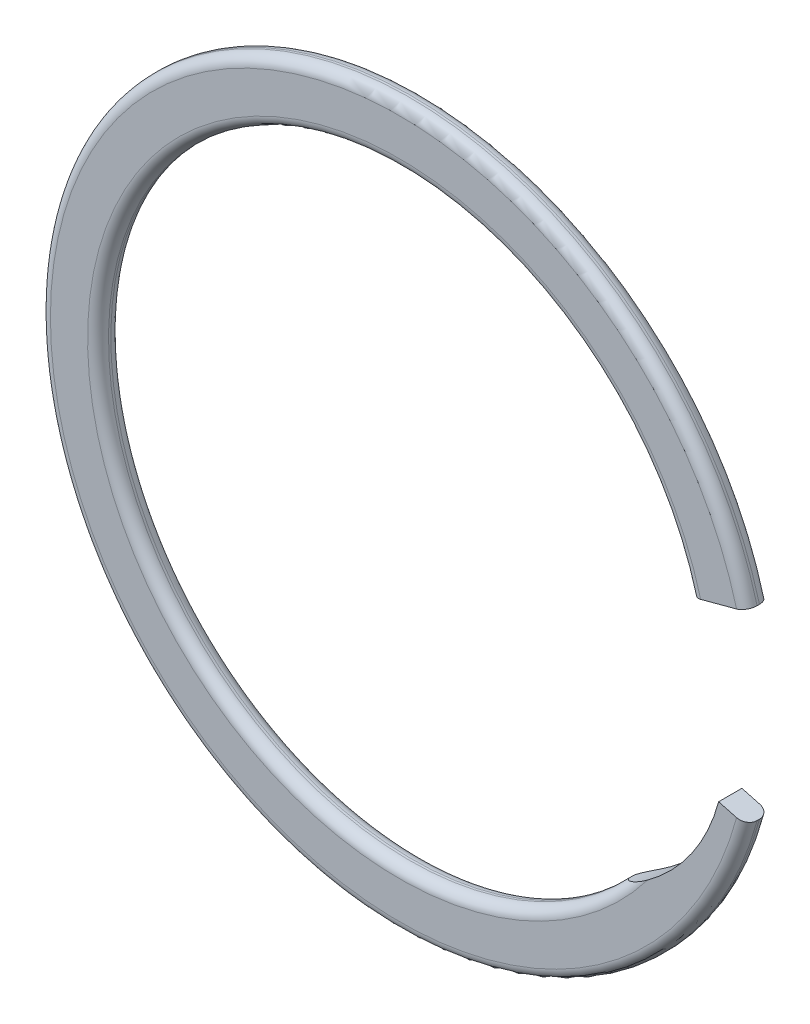
ISO-10303-21;
HEADER;
FILE_DESCRIPTION(('STEP AP214'),'2;1');
FILE_NAME('part.step','',(''),(''),'','','');
FILE_SCHEMA(('AUTOMOTIVE_DESIGN { 1 0 10303 214 1 1 1 1 }'));
ENDSEC;
DATA;
#1=APPLICATION_CONTEXT('core data for automotive mechanical design processes');
#2=APPLICATION_PROTOCOL_DEFINITION('international standard','automotive_design',2000,#1);
#3=PRODUCT_CONTEXT('',#1,'mechanical');
#4=PRODUCT('Part','Part','',(#3));
#5=PRODUCT_RELATED_PRODUCT_CATEGORY('part','',(#4));
#6=PRODUCT_DEFINITION_FORMATION('','',#4);
#7=PRODUCT_DEFINITION_CONTEXT('part definition',#1,'design');
#8=PRODUCT_DEFINITION('design','',#6,#7);
#9=PRODUCT_DEFINITION_SHAPE('','',#8);
#10=(LENGTH_UNIT() NAMED_UNIT(*) SI_UNIT(.MILLI.,.METRE.));
#11=(NAMED_UNIT(*) PLANE_ANGLE_UNIT() SI_UNIT($,.RADIAN.));
#12=(NAMED_UNIT(*) SI_UNIT($,.STERADIAN.) SOLID_ANGLE_UNIT());
#13=UNCERTAINTY_MEASURE_WITH_UNIT(LENGTH_MEASURE(1.E-05),#10,'distance_accuracy_value','');
#14=(GEOMETRIC_REPRESENTATION_CONTEXT(3) GLOBAL_UNCERTAINTY_ASSIGNED_CONTEXT((#13)) GLOBAL_UNIT_ASSIGNED_CONTEXT((#10,
#11,#12)) REPRESENTATION_CONTEXT('',''));
#15=CARTESIAN_POINT('',(0.,0.,0.));
#16=DIRECTION('',(0.,0.,1.));
#17=DIRECTION('',(1.,0.,0.));
#18=AXIS2_PLACEMENT_3D('',#15,#16,#17);
#19=CARTESIAN_POINT('',(0.,0.,0.2286));
#20=DIRECTION('',(0.,0.,-1.));
#21=DIRECTION('',(-1.,0.,0.));
#22=AXIS2_PLACEMENT_3D('',#19,#20,#21);
#23=CYLINDRICAL_SURFACE('',#22,5.9309);
#24=DIRECTION('',(0.,0.,-1.));
#25=VECTOR('',#24,1.);
#26=CARTESIAN_POINT('',(4.33674876081944,-4.04576136166371,0.2286));
#27=LINE('',#26,#25);
#28=CARTESIAN_POINT('',(4.33674876081944,-4.04576136166371,0.02286));
#29=VERTEX_POINT('',#28);
#30=CARTESIAN_POINT('',(4.33674876081944,-4.04576136166371,-0.02286));
#31=VERTEX_POINT('',#30);
#32=EDGE_CURVE('E125',#29,#31,#27,.T.);
#33=ORIENTED_EDGE('',*,*,#32,.T.);
#34=CARTESIAN_POINT('',(0.,0.,-0.02286));
#35=DIRECTION('',(0.,0.,1.));
#36=DIRECTION('',(1.,0.,0.));
#37=AXIS2_PLACEMENT_3D('',#34,#35,#36);
#38=CIRCLE('',#37,5.9309);
#39=CARTESIAN_POINT('',(5.72880948313784,1.53502987459854,-0.02286));
#40=VERTEX_POINT('',#39);
#41=EDGE_CURVE('E151',#31,#40,#38,.F.);
#42=ORIENTED_EDGE('',*,*,#41,.T.);
#43=DIRECTION('',(0.,0.,-1.));
#44=VECTOR('',#43,1.);
#45=CARTESIAN_POINT('',(5.72880948313784,1.53502987459854,0.2286));
#46=LINE('',#45,#44);
#47=CARTESIAN_POINT('',(5.72880948313784,1.53502987459854,0.02286));
#48=VERTEX_POINT('',#47);
#49=EDGE_CURVE('E146',#48,#40,#46,.T.);
#50=ORIENTED_EDGE('',*,*,#49,.F.);
#51=CARTESIAN_POINT('',(0.,0.,0.02286));
#52=DIRECTION('',(0.,0.,1.));
#53=DIRECTION('',(1.,0.,0.));
#54=AXIS2_PLACEMENT_3D('',#51,#52,#53);
#55=CIRCLE('',#54,5.9309);
#56=EDGE_CURVE('E149',#48,#29,#55,.T.);
#57=ORIENTED_EDGE('',*,*,#56,.T.);
#58=EDGE_LOOP('',(#33,#42,#50,#57));
#59=FACE_BOUND('',#58,.T.);
#60=ADVANCED_FACE('F34',(#59),#23,.F.);
#61=CARTESIAN_POINT('',(5.72880948313784,1.53502987459854,0.2286));
#62=DIRECTION('',(-0.258819045102521,0.965925826289068,0.));
#63=DIRECTION('',(-0.965925826289068,-0.258819045102522,0.));
#64=AXIS2_PLACEMENT_3D('',#61,#62,#63);
#65=PLANE('',#64);
#66=ORIENTED_EDGE('',*,*,#49,.T.);
#67=CARTESIAN_POINT('',(5.92753906263855,1.58827930493794,-0.02286));
#68=DIRECTION('',(-0.258819045102521,0.965925826289068,0.));
#69=DIRECTION('',(-0.965925826289068,-0.258819045102522,0.));
#70=AXIS2_PLACEMENT_3D('',#67,#68,#69);
#71=CIRCLE('',#70,0.20574);
#72=CARTESIAN_POINT('',(5.92753906263855,1.58827930493794,-0.2286));
#73=VERTEX_POINT('',#72);
#74=EDGE_CURVE('E160',#40,#73,#71,.F.);
#75=ORIENTED_EDGE('',*,*,#74,.T.);
#76=DIRECTION('',(0.965925826289068,0.258819045102521,0.));
#77=VECTOR('',#76,1.);
#78=CARTESIAN_POINT('',(5.72880948313784,1.53502987459854,-0.2286));
#79=LINE('',#78,#77);
#80=CARTESIAN_POINT('',(6.63413312308553,1.77761061281133,-0.2286));
#81=VERTEX_POINT('',#80);
#82=EDGE_CURVE('E136',#73,#81,#79,.T.);
#83=ORIENTED_EDGE('',*,*,#82,.T.);
#84=CARTESIAN_POINT('',(6.63413312308553,1.77761061281133,-0.02286));
#85=DIRECTION('',(-0.258819045102521,0.965925826289068,0.));
#86=DIRECTION('',(-0.965925826289068,-0.258819045102522,0.));
#87=AXIS2_PLACEMENT_3D('',#84,#85,#86);
#88=CIRCLE('',#87,0.20574);
#89=CARTESIAN_POINT('',(6.83286270258624,1.83086004315073,-0.02286));
#90=VERTEX_POINT('',#89);
#91=EDGE_CURVE('E156',#81,#90,#88,.F.);
#92=ORIENTED_EDGE('',*,*,#91,.T.);
#93=DIRECTION('',(0.,0.,-1.));
#94=VECTOR('',#93,1.);
#95=CARTESIAN_POINT('',(6.83286270258624,1.83086004315073,0.2286));
#96=LINE('',#95,#94);
#97=CARTESIAN_POINT('',(6.83286270258624,1.83086004315073,0.02286));
#98=VERTEX_POINT('',#97);
#99=EDGE_CURVE('E143',#98,#90,#96,.T.);
#100=ORIENTED_EDGE('',*,*,#99,.F.);
#101=CARTESIAN_POINT('',(6.63413312308553,1.77761061281133,0.02286));
#102=DIRECTION('',(-0.258819045102521,0.965925826289068,0.));
#103=DIRECTION('',(-0.965925826289068,-0.258819045102522,0.));
#104=AXIS2_PLACEMENT_3D('',#101,#102,#103);
#105=CIRCLE('',#104,0.20574);
#106=CARTESIAN_POINT('',(6.63413312308553,1.77761061281133,0.2286));
#107=VERTEX_POINT('',#106);
#108=EDGE_CURVE('E154',#98,#107,#105,.F.);
#109=ORIENTED_EDGE('',*,*,#108,.T.);
#110=DIRECTION('',(0.965925826289068,0.258819045102521,0.));
#111=VECTOR('',#110,1.);
#112=CARTESIAN_POINT('',(5.72880948313784,1.53502987459854,0.2286));
#113=LINE('',#112,#111);
#114=CARTESIAN_POINT('',(5.92753906263855,1.58827930493794,0.2286));
#115=VERTEX_POINT('',#114);
#116=EDGE_CURVE('E114',#115,#107,#113,.T.);
#117=ORIENTED_EDGE('',*,*,#116,.F.);
#118=CARTESIAN_POINT('',(5.92753906263855,1.58827930493794,0.02286));
#119=DIRECTION('',(-0.258819045102521,0.965925826289068,0.));
#120=DIRECTION('',(-0.965925826289068,-0.258819045102522,0.));
#121=AXIS2_PLACEMENT_3D('',#118,#119,#120);
#122=CIRCLE('',#121,0.20574);
#123=EDGE_CURVE('E158',#115,#48,#122,.F.);
#124=ORIENTED_EDGE('',*,*,#123,.T.);
#125=EDGE_LOOP('',(#66,#75,#83,#92,#100,#109,#117,#124));
#126=FACE_BOUND('',#125,.T.);
#127=ADVANCED_FACE('F192',(#126),#65,.F.);
#128=CARTESIAN_POINT('',(0.,0.,0.2286));
#129=DIRECTION('',(0.,0.,-1.));
#130=DIRECTION('',(-1.,0.,0.));
#131=AXIS2_PLACEMENT_3D('',#128,#129,#130);
#132=CYLINDRICAL_SURFACE('',#131,7.0739);
#133=ORIENTED_EDGE('',*,*,#99,.T.);
#134=CARTESIAN_POINT('',(0.,0.,-0.02286));
#135=DIRECTION('',(0.,0.,1.));
#136=DIRECTION('',(1.,0.,0.));
#137=AXIS2_PLACEMENT_3D('',#134,#135,#136);
#138=CIRCLE('',#137,7.0739);
#139=CARTESIAN_POINT('',(6.83286270258624,-1.83086004315073,-0.02286));
#140=VERTEX_POINT('',#139);
#141=EDGE_CURVE('E218',#90,#140,#138,.T.);
#142=ORIENTED_EDGE('',*,*,#141,.T.);
#143=DIRECTION('',(0.,0.,-1.));
#144=VECTOR('',#143,1.);
#145=CARTESIAN_POINT('',(6.83286270258624,-1.83086004315073,0.2286));
#146=LINE('',#145,#144);
#147=CARTESIAN_POINT('',(6.83286270258624,-1.83086004315073,0.02286));
#148=VERTEX_POINT('',#147);
#149=EDGE_CURVE('E124',#148,#140,#146,.T.);
#150=ORIENTED_EDGE('',*,*,#149,.F.);
#151=CARTESIAN_POINT('',(0.,0.,0.02286));
#152=DIRECTION('',(0.,0.,1.));
#153=DIRECTION('',(1.,0.,0.));
#154=AXIS2_PLACEMENT_3D('',#151,#152,#153);
#155=CIRCLE('',#154,7.0739);
#156=EDGE_CURVE('E214',#148,#98,#155,.F.);
#157=ORIENTED_EDGE('',*,*,#156,.T.);
#158=EDGE_LOOP('',(#133,#142,#150,#157));
#159=FACE_BOUND('',#158,.T.);
#160=ADVANCED_FACE('F189',(#159),#132,.T.);
#161=CARTESIAN_POINT('',(6.28083609286204,-1.68294495887463,0.2286));
#162=DIRECTION('',(-0.258819045102523,-0.965925826289068,0.));
#163=DIRECTION('',(0.965925826289068,-0.258819045102523,0.));
#164=AXIS2_PLACEMENT_3D('',#161,#162,#163);
#165=PLANE('',#164);
#166=ORIENTED_EDGE('',*,*,#149,.T.);
#167=CARTESIAN_POINT('',(6.63413312308553,-1.77761061281134,-0.02286));
#168=DIRECTION('',(-0.258819045102523,-0.965925826289068,0.));
#169=DIRECTION('',(0.965925826289068,-0.258819045102523,0.));
#170=AXIS2_PLACEMENT_3D('',#167,#168,#169);
#171=CIRCLE('',#170,0.20574);
#172=CARTESIAN_POINT('',(6.63413312308553,-1.77761061281133,-0.2286));
#173=VERTEX_POINT('',#172);
#174=EDGE_CURVE('E11',#140,#173,#171,.F.);
#175=ORIENTED_EDGE('',*,*,#174,.T.);
#176=DIRECTION('',(-0.965925826289068,0.258819045102523,0.));
#177=VECTOR('',#176,1.);
#178=CARTESIAN_POINT('',(6.28083609286204,-1.68294495887463,-0.2286));
#179=LINE('',#178,#177);
#180=CARTESIAN_POINT('',(6.28083609286204,-1.68294495887464,-0.2286));
#181=VERTEX_POINT('',#180);
#182=EDGE_CURVE('E120',#173,#181,#179,.T.);
#183=ORIENTED_EDGE('',*,*,#182,.T.);
#184=DIRECTION('',(0.,0.,-1.));
#185=VECTOR('',#184,1.);
#186=CARTESIAN_POINT('',(6.28083609286204,-1.68294495887464,0.2286));
#187=LINE('',#186,#185);
#188=CARTESIAN_POINT('',(6.28083609286204,-1.68294495887464,0.2286));
#189=VERTEX_POINT('',#188);
#190=EDGE_CURVE('E117',#189,#181,#187,.T.);
#191=ORIENTED_EDGE('',*,*,#190,.F.);
#192=DIRECTION('',(-0.965925826289068,0.258819045102523,0.));
#193=VECTOR('',#192,1.);
#194=CARTESIAN_POINT('',(6.28083609286204,-1.68294495887463,0.2286));
#195=LINE('',#194,#193);
#196=CARTESIAN_POINT('',(6.63413312308553,-1.77761061281133,0.2286));
#197=VERTEX_POINT('',#196);
#198=EDGE_CURVE('E104',#197,#189,#195,.T.);
#199=ORIENTED_EDGE('',*,*,#198,.F.);
#200=CARTESIAN_POINT('',(6.63413312308553,-1.77761061281134,0.02286));
#201=DIRECTION('',(-0.258819045102523,-0.965925826289068,0.));
#202=DIRECTION('',(0.965925826289068,-0.258819045102523,0.));
#203=AXIS2_PLACEMENT_3D('',#200,#201,#202);
#204=CIRCLE('',#203,0.20574);
#205=EDGE_CURVE('E42',#197,#148,#204,.F.);
#206=ORIENTED_EDGE('',*,*,#205,.T.);
#207=EDGE_LOOP('',(#166,#175,#183,#191,#199,#206));
#208=FACE_BOUND('',#207,.T.);
#209=ADVANCED_FACE('F118',(#208),#165,.F.);
#210=CARTESIAN_POINT('',(2.71006084757936,-0.726158615548096,0.2286));
#211=DIRECTION('',(0.,0.,-1.));
#212=DIRECTION('',(-1.,0.,0.));
#213=AXIS2_PLACEMENT_3D('',#210,#211,#212);
#214=CYLINDRICAL_SURFACE('',#213,3.69673855703913);
#215=CARTESIAN_POINT('',(2.71006084757936,-0.726158615548096,-0.2286));
#216=DIRECTION('',(0.,0.,-1.));
#217=DIRECTION('',(1.,0.,0.));
#218=AXIS2_PLACEMENT_3D('',#215,#216,#217);
#219=CIRCLE('',#218,3.69673855703913);
#220=CARTESIAN_POINT('',(4.88293512970802,-3.7168931930664,-0.2286));
#221=VERTEX_POINT('',#220);
#222=EDGE_CURVE('E140',#181,#221,#219,.T.);
#223=ORIENTED_EDGE('',*,*,#222,.T.);
#224=CARTESIAN_POINT('',(4.88293512970802,-3.7168931930664,-0.2286));
#225=CARTESIAN_POINT('',(4.85500999048043,-3.73718480015805,-0.22857598633639));
#226=CARTESIAN_POINT('',(4.82678371847806,-3.75709168563463,-0.227877611855226));
#227=CARTESIAN_POINT('',(4.76971688214283,-3.79615687237785,-0.224804039124091));
#228=CARTESIAN_POINT('',(4.74087406791521,-3.81531125230595,-0.222421040885583));
#229=CARTESIAN_POINT('',(4.68279549296216,-3.85272060605818,-0.215640895704051));
#230=CARTESIAN_POINT('',(4.65355936639807,-3.87097465646647,-0.211241726592157));
#231=CARTESIAN_POINT('',(4.59499410125154,-3.90642075786539,-0.199851654175218));
#232=CARTESIAN_POINT('',(4.56566529968985,-3.92361501631156,-0.192866366096427));
#233=CARTESIAN_POINT('',(4.5240823231615,-3.94724672337064,-0.180241865164753));
#234=CARTESIAN_POINT('',(4.51166420925926,-3.95420768452427,-0.17612092652061));
#235=CARTESIAN_POINT('',(4.48694979879772,-3.96787744048558,-0.167024558330789));
#236=CARTESIAN_POINT('',(4.47465390292598,-3.97458553257987,-0.162046934894695));
#237=CARTESIAN_POINT('',(4.44861031866038,-3.9886072371568,-0.150232920622503));
#238=CARTESIAN_POINT('',(4.4349085361413,-3.99586894792579,-0.143232084033136));
#239=CARTESIAN_POINT('',(4.40833007378779,-4.00975084472933,-0.127320289933747));
#240=CARTESIAN_POINT('',(4.39544960193044,-4.01637406433137,-0.11841908411254));
#241=CARTESIAN_POINT('',(4.37889034593777,-4.02478132803539,-0.104088359105282));
#242=CARTESIAN_POINT('',(4.37441089603554,-4.02704304248311,-0.0998753653690214));
#243=CARTESIAN_POINT('',(4.365857981209,-4.03134159102279,-0.0909220075326654));
#244=CARTESIAN_POINT('',(4.3617854394482,-4.03337791484388,-0.0861804936721551));
#245=CARTESIAN_POINT('',(4.35419870786395,-4.03715618621016,-0.0760248033159322));
#246=CARTESIAN_POINT('',(4.3506941373312,-4.03889308879439,-0.0706013501382703));
#247=CARTESIAN_POINT('',(4.34466316686099,-4.04187309697079,-0.0591343476118354));
#248=CARTESIAN_POINT('',(4.34212993007643,-4.04311965557892,-0.0530955258213677));
#249=CARTESIAN_POINT('',(4.33913969379564,-4.04458893631118,-0.0429699842435667));
#250=CARTESIAN_POINT('',(4.33825830658744,-4.0450213328128,-0.0390393744738257));
#251=CARTESIAN_POINT('',(4.33705595407163,-4.0456108346662,-0.031030364012218));
#252=CARTESIAN_POINT('',(4.3367412323829,-4.04576487308681,-0.0269508161593582));
#253=CARTESIAN_POINT('',(4.33674876081945,-4.04576136166371,-0.0228599999999982));
#254=B_SPLINE_CURVE_WITH_KNOTS('',3,(#224,#225,#226,#227,#228,#229,#230,#231,#232,#233,#234,
#235,#236,#237,#238,#239,#240,#241,#242,#243,#244,#245,#246,#247,#248,#249,#250,#251,#252,#253),
.UNSPECIFIED.,.F.,.F.,(4,2,2,2,2,2,2,2,2,2,2,2,2,2,4),(0.,0.103574883488879,0.207632497579968,
0.311794708025222,0.415732065518152,0.460174185751379,0.504731859317852,0.555705758998102,
0.606424118271238,0.626052994760703,0.645725438153526,0.665702413784007,0.685536078500329,
0.697642350721565,0.709881214158057),.UNSPECIFIED.);
#255=EDGE_CURVE('E172',#221,#31,#254,.T.);
#256=ORIENTED_EDGE('',*,*,#255,.T.);
#257=ORIENTED_EDGE('',*,*,#32,.F.);
#258=CARTESIAN_POINT('',(4.33674876081944,-4.04576136166371,0.02286));
#259=CARTESIAN_POINT('',(4.3367362727958,-4.04576720277836,0.0275271861583305));
#260=CARTESIAN_POINT('',(4.33714823086727,-4.04556562626622,0.0321754645828708));
#261=CARTESIAN_POINT('',(4.33870358603332,-4.0448029154333,0.0412597657334038));
#262=CARTESIAN_POINT('',(4.33983771175834,-4.04424633854685,0.0456977236162895));
#263=CARTESIAN_POINT('',(4.34307939064918,-4.04265226714418,0.0553669519197759));
#264=CARTESIAN_POINT('',(4.34535752088293,-4.04153027497126,0.0605256544229723));
#265=CARTESIAN_POINT('',(4.35062402800406,-4.0389274236869,0.0703870234394635));
#266=CARTESIAN_POINT('',(4.35361604217961,-4.0374447259709,0.0750871749118721));
#267=CARTESIAN_POINT('',(4.36226108555504,-4.03314307801549,0.0870174646744449));
#268=CARTESIAN_POINT('',(4.36835612562716,-4.03009333799332,0.0938390834626509));
#269=CARTESIAN_POINT('',(4.38131554270638,-4.02355715354994,0.10644254062159));
#270=CARTESIAN_POINT('',(4.3881815368049,-4.02006978933266,0.112222124602041));
#271=CARTESIAN_POINT('',(4.40460153285923,-4.01165966002171,0.124654366077831));
#272=CARTESIAN_POINT('',(4.41432236948526,-4.00663013087247,0.131010917104611));
#273=CARTESIAN_POINT('',(4.43420525240276,-3.99622422643898,0.142677416740759));
#274=CARTESIAN_POINT('',(4.44436809935955,-3.99084721236335,0.14798536058676));
#275=CARTESIAN_POINT('',(4.47542156810115,-3.97422418401299,0.162782599127292));
#276=CARTESIAN_POINT('',(4.49669016520084,-3.96258141090079,0.171020514765729));
#277=CARTESIAN_POINT('',(4.54972845094279,-3.93284169266256,0.188701749215234));
#278=CARTESIAN_POINT('',(4.58166632291076,-3.91431594356434,0.196844583301894));
#279=CARTESIAN_POINT('',(4.64550948914109,-3.87596963916609,0.209969550899087));
#280=CARTESIAN_POINT('',(4.67741436431413,-3.85614519123583,0.214941653369562));
#281=CARTESIAN_POINT('',(4.73862419348425,-3.81679572228647,0.222219131976566));
#282=CARTESIAN_POINT('',(4.76795771930719,-3.79734296200928,0.224683643058169));
#283=CARTESIAN_POINT('',(4.82594000449899,-3.75768657530716,0.227855929081208));
#284=CARTESIAN_POINT('',(4.85459192228049,-3.73748847878093,0.228574721025615));
#285=CARTESIAN_POINT('',(4.88293512970802,-3.7168931930664,0.2286));
#286=B_SPLINE_CURVE_WITH_KNOTS('',3,(#258,#259,#260,#261,#262,#263,#264,#265,#266,#267,#268,
#269,#270,#271,#272,#273,#274,#275,#276,#277,#278,#279,#280,#281,#282,#283,#284,#285),
.UNSPECIFIED.,.F.,.F.,(4,2,2,2,2,2,2,2,2,2,2,2,2,4),(0.,0.0139486447173142,0.0277217276401701,
0.0448746041940708,0.0621168157757347,0.0908824801009072,0.11970964966365,0.157592812717243,
0.195547715723264,0.272182174539348,0.385383906461935,0.498942013646631,0.604733138235503,
0.709854873940268),.UNSPECIFIED.);
#287=CARTESIAN_POINT('',(4.88293512970802,-3.7168931930664,0.2286));
#288=VERTEX_POINT('',#287);
#289=EDGE_CURVE('E130',#29,#288,#286,.T.);
#290=ORIENTED_EDGE('',*,*,#289,.T.);
#291=CARTESIAN_POINT('',(2.71006084757936,-0.726158615548096,0.2286));
#292=DIRECTION('',(0.,0.,-1.));
#293=DIRECTION('',(1.,0.,0.));
#294=AXIS2_PLACEMENT_3D('',#291,#292,#293);
#295=CIRCLE('',#294,3.69673855703913);
#296=EDGE_CURVE('E109',#189,#288,#295,.T.);
#297=ORIENTED_EDGE('',*,*,#296,.F.);
#298=ORIENTED_EDGE('',*,*,#190,.T.);
#299=EDGE_LOOP('',(#223,#256,#257,#290,#297,#298));
#300=FACE_BOUND('',#299,.T.);
#301=ADVANCED_FACE('F127',(#300),#214,.F.);
#302=CARTESIAN_POINT('',(0.,0.,0.2286));
#303=DIRECTION('',(0.,0.,1.));
#304=DIRECTION('',(1.,0.,0.));
#305=AXIS2_PLACEMENT_3D('',#302,#303,#304);
#306=PLANE('',#305);
#307=ORIENTED_EDGE('',*,*,#296,.T.);
#308=CARTESIAN_POINT('',(0.,0.,0.2286));
#309=DIRECTION('',(0.,0.,1.));
#310=DIRECTION('',(1.,0.,0.));
#311=AXIS2_PLACEMENT_3D('',#308,#309,#310);
#312=CIRCLE('',#311,6.13664);
#313=EDGE_CURVE('E213',#288,#115,#312,.F.);
#314=ORIENTED_EDGE('',*,*,#313,.T.);
#315=ORIENTED_EDGE('',*,*,#116,.T.);
#316=CARTESIAN_POINT('',(0.,0.,0.2286));
#317=DIRECTION('',(0.,0.,1.));
#318=DIRECTION('',(1.,0.,0.));
#319=AXIS2_PLACEMENT_3D('',#316,#317,#318);
#320=CIRCLE('',#319,6.86816);
#321=EDGE_CURVE('E113',#107,#197,#320,.T.);
#322=ORIENTED_EDGE('',*,*,#321,.T.);
#323=ORIENTED_EDGE('',*,*,#198,.T.);
#324=EDGE_LOOP('',(#307,#314,#315,#322,#323));
#325=FACE_BOUND('',#324,.T.);
#326=ADVANCED_FACE('F106',(#325),#306,.T.);
#327=CARTESIAN_POINT('',(0.,0.,-0.2286));
#328=DIRECTION('',(0.,0.,1.));
#329=DIRECTION('',(1.,0.,0.));
#330=AXIS2_PLACEMENT_3D('',#327,#328,#329);
#331=PLANE('',#330);
#332=ORIENTED_EDGE('',*,*,#82,.F.);
#333=CARTESIAN_POINT('',(0.,0.,-0.2286));
#334=DIRECTION('',(0.,0.,1.));
#335=DIRECTION('',(1.,0.,0.));
#336=AXIS2_PLACEMENT_3D('',#333,#334,#335);
#337=CIRCLE('',#336,6.13664);
#338=EDGE_CURVE('E164',#73,#221,#337,.T.);
#339=ORIENTED_EDGE('',*,*,#338,.T.);
#340=ORIENTED_EDGE('',*,*,#222,.F.);
#341=ORIENTED_EDGE('',*,*,#182,.F.);
#342=CARTESIAN_POINT('',(0.,0.,-0.2286));
#343=DIRECTION('',(0.,0.,1.));
#344=DIRECTION('',(1.,0.,0.));
#345=AXIS2_PLACEMENT_3D('',#342,#343,#344);
#346=CIRCLE('',#345,6.86816);
#347=EDGE_CURVE('E162',#173,#81,#346,.F.);
#348=ORIENTED_EDGE('',*,*,#347,.T.);
#349=EDGE_LOOP('',(#332,#339,#340,#341,#348));
#350=FACE_BOUND('',#349,.T.);
#351=ADVANCED_FACE('F184',(#350),#331,.F.);
#352=CARTESIAN_POINT('',(0.,0.,-0.02286));
#353=DIRECTION('',(0.,0.,1.));
#354=DIRECTION('',(1.,0.,0.));
#355=AXIS2_PLACEMENT_3D('',#352,#353,#354);
#356=TOROIDAL_SURFACE('',#355,6.13664,0.20574);
#357=ORIENTED_EDGE('',*,*,#255,.F.);
#358=ORIENTED_EDGE('',*,*,#338,.F.);
#359=ORIENTED_EDGE('',*,*,#74,.F.);
#360=ORIENTED_EDGE('',*,*,#41,.F.);
#361=EDGE_LOOP('',(#357,#358,#359,#360));
#362=FACE_BOUND('',#361,.T.);
#363=ADVANCED_FACE('F199',(#362),#356,.T.);
#364=CARTESIAN_POINT('',(0.,0.,0.02286));
#365=DIRECTION('',(0.,0.,1.));
#366=DIRECTION('',(1.,0.,0.));
#367=AXIS2_PLACEMENT_3D('',#364,#365,#366);
#368=TOROIDAL_SURFACE('',#367,6.13664,0.20574);
#369=ORIENTED_EDGE('',*,*,#289,.F.);
#370=ORIENTED_EDGE('',*,*,#56,.F.);
#371=ORIENTED_EDGE('',*,*,#123,.F.);
#372=ORIENTED_EDGE('',*,*,#313,.F.);
#373=EDGE_LOOP('',(#369,#370,#371,#372));
#374=FACE_BOUND('',#373,.T.);
#375=ADVANCED_FACE('F178',(#374),#368,.T.);
#376=CARTESIAN_POINT('',(0.,0.,-0.02286));
#377=DIRECTION('',(0.,0.,1.));
#378=DIRECTION('',(1.,0.,0.));
#379=AXIS2_PLACEMENT_3D('',#376,#377,#378);
#380=TOROIDAL_SURFACE('',#379,6.86816,0.20574);
#381=ORIENTED_EDGE('',*,*,#91,.F.);
#382=ORIENTED_EDGE('',*,*,#347,.F.);
#383=ORIENTED_EDGE('',*,*,#174,.F.);
#384=ORIENTED_EDGE('',*,*,#141,.F.);
#385=EDGE_LOOP('',(#381,#382,#383,#384));
#386=FACE_BOUND('',#385,.T.);
#387=ADVANCED_FACE('F207',(#386),#380,.T.);
#388=CARTESIAN_POINT('',(0.,0.,0.02286));
#389=DIRECTION('',(0.,0.,1.));
#390=DIRECTION('',(1.,0.,0.));
#391=AXIS2_PLACEMENT_3D('',#388,#389,#390);
#392=TOROIDAL_SURFACE('',#391,6.86816,0.20574);
#393=ORIENTED_EDGE('',*,*,#108,.F.);
#394=ORIENTED_EDGE('',*,*,#156,.F.);
#395=ORIENTED_EDGE('',*,*,#205,.F.);
#396=ORIENTED_EDGE('',*,*,#321,.F.);
#397=EDGE_LOOP('',(#393,#394,#395,#396));
#398=FACE_BOUND('',#397,.T.);
#399=ADVANCED_FACE('F36',(#398),#392,.T.);
#400=CLOSED_SHELL('',(#60,#127,#160,#209,#301,#326,#351,#363,#375,#387,#399));
#401=MANIFOLD_SOLID_BREP('B2',#400);
#402=ADVANCED_BREP_SHAPE_REPRESENTATION('',(#18,#401),#14);
#403=SHAPE_DEFINITION_REPRESENTATION(#9,#402);
ENDSEC;
END-ISO-10303-21;
